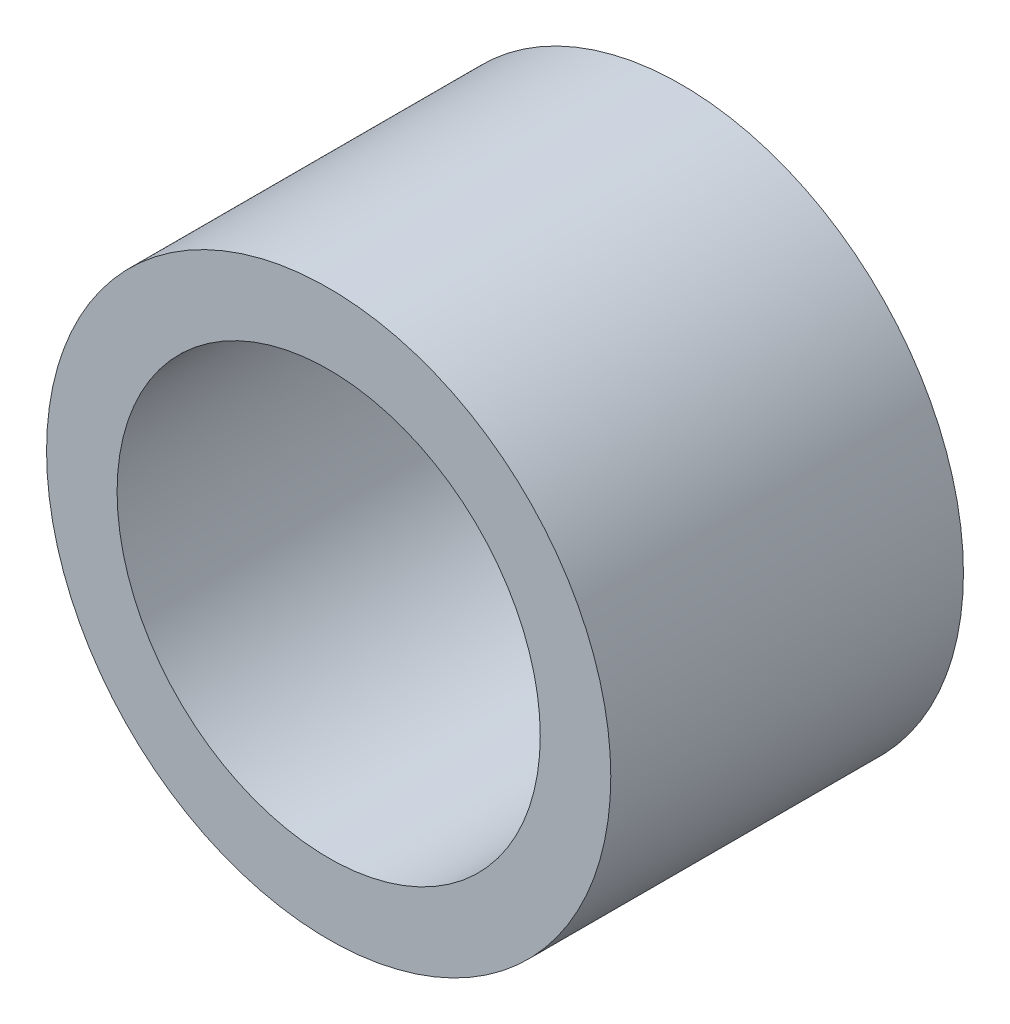
ISO-10303-21;
HEADER;
FILE_DESCRIPTION(('STEP AP214'),'2;1');
FILE_NAME('part.step','',(''),(''),'','','');
FILE_SCHEMA(('AUTOMOTIVE_DESIGN { 1 0 10303 214 1 1 1 1 }'));
ENDSEC;
DATA;
#1=APPLICATION_CONTEXT('core data for automotive mechanical design processes');
#2=APPLICATION_PROTOCOL_DEFINITION('international standard','automotive_design',2000,#1);
#3=PRODUCT_CONTEXT('',#1,'mechanical');
#4=PRODUCT('Part','Part','',(#3));
#5=PRODUCT_RELATED_PRODUCT_CATEGORY('part','',(#4));
#6=PRODUCT_DEFINITION_FORMATION('','',#4);
#7=PRODUCT_DEFINITION_CONTEXT('part definition',#1,'design');
#8=PRODUCT_DEFINITION('design','',#6,#7);
#9=PRODUCT_DEFINITION_SHAPE('','',#8);
#10=(LENGTH_UNIT() NAMED_UNIT(*) SI_UNIT(.MILLI.,.METRE.));
#11=(NAMED_UNIT(*) PLANE_ANGLE_UNIT() SI_UNIT($,.RADIAN.));
#12=(NAMED_UNIT(*) SI_UNIT($,.STERADIAN.) SOLID_ANGLE_UNIT());
#13=UNCERTAINTY_MEASURE_WITH_UNIT(LENGTH_MEASURE(1.E-05),#10,'distance_accuracy_value','');
#14=(GEOMETRIC_REPRESENTATION_CONTEXT(3) GLOBAL_UNCERTAINTY_ASSIGNED_CONTEXT((#13)) GLOBAL_UNIT_ASSIGNED_CONTEXT((#10,
#11,#12)) REPRESENTATION_CONTEXT('',''));
#15=CARTESIAN_POINT('',(0.,0.,0.));
#16=DIRECTION('',(0.,0.,1.));
#17=DIRECTION('',(1.,0.,0.));
#18=AXIS2_PLACEMENT_3D('',#15,#16,#17);
#19=CARTESIAN_POINT('',(0.,0.,2.5));
#20=DIRECTION('',(0.,0.,-1.));
#21=DIRECTION('',(-1.,0.,0.));
#22=AXIS2_PLACEMENT_3D('',#19,#20,#21);
#23=CYLINDRICAL_SURFACE('',#22,2.);
#24=CARTESIAN_POINT('',(0.,0.,2.5));
#25=DIRECTION('',(0.,0.,1.));
#26=DIRECTION('',(1.,0.,0.));
#27=AXIS2_PLACEMENT_3D('',#24,#25,#26);
#28=CIRCLE('',#27,2.);
#29=CARTESIAN_POINT('',(2.,0.,2.5));
#30=VERTEX_POINT('',#29);
#31=EDGE_CURVE('E10',#30,#30,#28,.T.);
#32=ORIENTED_EDGE('',*,*,#31,.F.);
#33=EDGE_LOOP('',(#32));
#34=FACE_BOUND('',#33,.T.);
#35=CARTESIAN_POINT('',(0.,0.,0.));
#36=DIRECTION('',(0.,0.,1.));
#37=DIRECTION('',(1.,0.,0.));
#38=AXIS2_PLACEMENT_3D('',#35,#36,#37);
#39=CIRCLE('',#38,2.);
#40=CARTESIAN_POINT('',(2.,0.,0.));
#41=VERTEX_POINT('',#40);
#42=EDGE_CURVE('E34',#41,#41,#39,.T.);
#43=ORIENTED_EDGE('',*,*,#42,.T.);
#44=EDGE_LOOP('',(#43));
#45=FACE_BOUND('',#44,.T.);
#46=ADVANCED_FACE('F31',(#34,#45),#23,.T.);
#47=CARTESIAN_POINT('',(0.,0.,2.5));
#48=DIRECTION('',(0.,0.,1.));
#49=DIRECTION('',(1.,0.,0.));
#50=AXIS2_PLACEMENT_3D('',#47,#48,#49);
#51=PLANE('',#50);
#52=CARTESIAN_POINT('',(0.,0.,2.5));
#53=DIRECTION('',(0.,0.,1.));
#54=DIRECTION('',(1.,0.,0.));
#55=AXIS2_PLACEMENT_3D('',#52,#53,#54);
#56=CIRCLE('',#55,1.5);
#57=CARTESIAN_POINT('',(1.5,0.,2.5));
#58=VERTEX_POINT('',#57);
#59=EDGE_CURVE('E41',#58,#58,#56,.T.);
#60=ORIENTED_EDGE('',*,*,#59,.F.);
#61=EDGE_LOOP('',(#60));
#62=FACE_BOUND('',#61,.T.);
#63=ORIENTED_EDGE('',*,*,#31,.T.);
#64=EDGE_LOOP('',(#63));
#65=FACE_BOUND('',#64,.T.);
#66=ADVANCED_FACE('F52',(#62,#65),#51,.T.);
#67=CARTESIAN_POINT('',(0.,0.,0.));
#68=DIRECTION('',(0.,0.,1.));
#69=DIRECTION('',(1.,0.,0.));
#70=AXIS2_PLACEMENT_3D('',#67,#68,#69);
#71=PLANE('',#70);
#72=CARTESIAN_POINT('',(0.,0.,0.));
#73=DIRECTION('',(0.,0.,1.));
#74=DIRECTION('',(1.,0.,0.));
#75=AXIS2_PLACEMENT_3D('',#72,#73,#74);
#76=CIRCLE('',#75,1.5);
#77=CARTESIAN_POINT('',(1.5,0.,0.));
#78=VERTEX_POINT('',#77);
#79=EDGE_CURVE('E43',#78,#78,#76,.T.);
#80=ORIENTED_EDGE('',*,*,#79,.T.);
#81=EDGE_LOOP('',(#80));
#82=FACE_BOUND('',#81,.T.);
#83=ORIENTED_EDGE('',*,*,#42,.F.);
#84=EDGE_LOOP('',(#83));
#85=FACE_BOUND('',#84,.T.);
#86=ADVANCED_FACE('F54',(#82,#85),#71,.F.);
#87=CARTESIAN_POINT('',(0.,0.,2.5));
#88=DIRECTION('',(0.,0.,-1.));
#89=DIRECTION('',(-1.,0.,0.));
#90=AXIS2_PLACEMENT_3D('',#87,#88,#89);
#91=CYLINDRICAL_SURFACE('',#90,1.5);
#92=ORIENTED_EDGE('',*,*,#59,.T.);
#93=EDGE_LOOP('',(#92));
#94=FACE_BOUND('',#93,.T.);
#95=ORIENTED_EDGE('',*,*,#79,.F.);
#96=EDGE_LOOP('',(#95));
#97=FACE_BOUND('',#96,.T.);
#98=ADVANCED_FACE('F49',(#94,#97),#91,.F.);
#99=CLOSED_SHELL('',(#46,#66,#86,#98));
#100=MANIFOLD_SOLID_BREP('B2',#99);
#101=ADVANCED_BREP_SHAPE_REPRESENTATION('',(#18,#100),#14);
#102=SHAPE_DEFINITION_REPRESENTATION(#9,#101);
ENDSEC;
END-ISO-10303-21;
